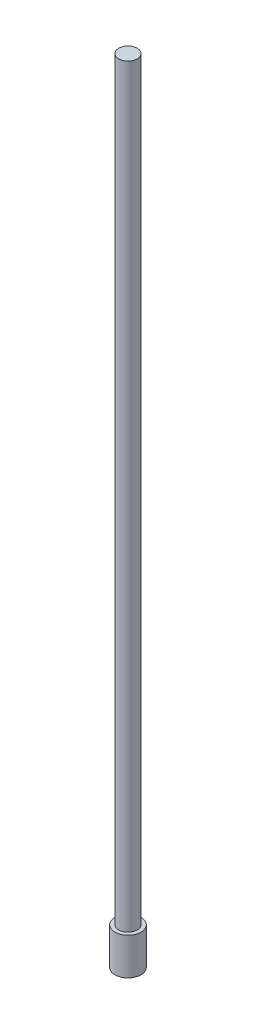
ISO-10303-21;
HEADER;
FILE_DESCRIPTION(('STEP AP214'),'2;1');
FILE_NAME('part.step','',(''),(''),'','','');
FILE_SCHEMA(('AUTOMOTIVE_DESIGN { 1 0 10303 214 1 1 1 1 }'));
ENDSEC;
DATA;
#1=APPLICATION_CONTEXT('core data for automotive mechanical design processes');
#2=APPLICATION_PROTOCOL_DEFINITION('international standard','automotive_design',2000,#1);
#3=PRODUCT_CONTEXT('',#1,'mechanical');
#4=PRODUCT('Part','Part','',(#3));
#5=PRODUCT_RELATED_PRODUCT_CATEGORY('part','',(#4));
#6=PRODUCT_DEFINITION_FORMATION('','',#4);
#7=PRODUCT_DEFINITION_CONTEXT('part definition',#1,'design');
#8=PRODUCT_DEFINITION('design','',#6,#7);
#9=PRODUCT_DEFINITION_SHAPE('','',#8);
#10=(LENGTH_UNIT() NAMED_UNIT(*) SI_UNIT(.MILLI.,.METRE.));
#11=(NAMED_UNIT(*) PLANE_ANGLE_UNIT() SI_UNIT($,.RADIAN.));
#12=(NAMED_UNIT(*) SI_UNIT($,.STERADIAN.) SOLID_ANGLE_UNIT());
#13=UNCERTAINTY_MEASURE_WITH_UNIT(LENGTH_MEASURE(1.E-05),#10,'distance_accuracy_value','');
#14=(GEOMETRIC_REPRESENTATION_CONTEXT(3) GLOBAL_UNCERTAINTY_ASSIGNED_CONTEXT((#13)) GLOBAL_UNIT_ASSIGNED_CONTEXT((#10,
#11,#12)) REPRESENTATION_CONTEXT('',''));
#15=CARTESIAN_POINT('',(0.,0.,0.));
#16=DIRECTION('',(0.,0.,1.));
#17=DIRECTION('',(1.,0.,0.));
#18=AXIS2_PLACEMENT_3D('',#15,#16,#17);
#19=CARTESIAN_POINT('',(0.,10.,0.));
#20=DIRECTION('',(0.,-1.,0.));
#21=DIRECTION('',(0.,0.,-1.));
#22=AXIS2_PLACEMENT_3D('',#19,#20,#21);
#23=CYLINDRICAL_SURFACE('',#22,2.5);
#24=CARTESIAN_POINT('',(0.,0.,0.));
#25=DIRECTION('',(0.,1.,0.));
#26=DIRECTION('',(0.,0.,1.));
#27=AXIS2_PLACEMENT_3D('',#24,#25,#26);
#28=CIRCLE('',#27,2.5);
#29=CARTESIAN_POINT('',(0.,0.,2.5));
#30=VERTEX_POINT('',#29);
#31=EDGE_CURVE('E56',#30,#30,#28,.T.);
#32=ORIENTED_EDGE('',*,*,#31,.F.);
#33=EDGE_LOOP('',(#32));
#34=FACE_BOUND('',#33,.T.);
#35=CARTESIAN_POINT('',(0.,6.25,0.));
#36=DIRECTION('',(0.,1.,0.));
#37=DIRECTION('',(0.,0.,1.));
#38=AXIS2_PLACEMENT_3D('',#35,#36,#37);
#39=CIRCLE('',#38,2.5);
#40=CARTESIAN_POINT('',(0.,6.25,2.5));
#41=VERTEX_POINT('',#40);
#42=EDGE_CURVE('E60',#41,#41,#39,.T.);
#43=ORIENTED_EDGE('',*,*,#42,.T.);
#44=EDGE_LOOP('',(#43));
#45=FACE_BOUND('',#44,.T.);
#46=ADVANCED_FACE('F41',(#34,#45),#23,.F.);
#47=CARTESIAN_POINT('',(0.,10.,0.));
#48=DIRECTION('',(0.,1.,0.));
#49=DIRECTION('',(0.,0.,1.));
#50=AXIS2_PLACEMENT_3D('',#47,#48,#49);
#51=PLANE('',#50);
#52=CARTESIAN_POINT('',(0.,10.,0.));
#53=DIRECTION('',(0.,1.,0.));
#54=DIRECTION('',(0.,0.,1.));
#55=AXIS2_PLACEMENT_3D('',#52,#53,#54);
#56=CIRCLE('',#55,3.5);
#57=CARTESIAN_POINT('',(0.,10.,3.5));
#58=VERTEX_POINT('',#57);
#59=EDGE_CURVE('E10',#58,#58,#56,.T.);
#60=ORIENTED_EDGE('',*,*,#59,.T.);
#61=EDGE_LOOP('',(#60));
#62=FACE_BOUND('',#61,.T.);
#63=CARTESIAN_POINT('',(0.,10.,0.));
#64=DIRECTION('',(0.,1.,0.));
#65=DIRECTION('',(0.,0.,1.));
#66=AXIS2_PLACEMENT_3D('',#63,#64,#65);
#67=CIRCLE('',#66,2.5);
#68=CARTESIAN_POINT('',(0.,10.,2.5));
#69=VERTEX_POINT('',#68);
#70=EDGE_CURVE('E54',#69,#69,#67,.T.);
#71=ORIENTED_EDGE('',*,*,#70,.F.);
#72=EDGE_LOOP('',(#71));
#73=FACE_BOUND('',#72,.T.);
#74=ADVANCED_FACE('F88',(#62,#73),#51,.T.);
#75=CARTESIAN_POINT('',(0.,0.,0.));
#76=DIRECTION('',(0.,1.,0.));
#77=DIRECTION('',(0.,0.,1.));
#78=AXIS2_PLACEMENT_3D('',#75,#76,#77);
#79=PLANE('',#78);
#80=CARTESIAN_POINT('',(0.,0.,0.));
#81=DIRECTION('',(0.,1.,0.));
#82=DIRECTION('',(0.,0.,1.));
#83=AXIS2_PLACEMENT_3D('',#80,#81,#82);
#84=CIRCLE('',#83,3.5);
#85=CARTESIAN_POINT('',(0.,0.,3.5));
#86=VERTEX_POINT('',#85);
#87=EDGE_CURVE('E45',#86,#86,#84,.T.);
#88=ORIENTED_EDGE('',*,*,#87,.F.);
#89=EDGE_LOOP('',(#88));
#90=FACE_BOUND('',#89,.T.);
#91=ORIENTED_EDGE('',*,*,#31,.T.);
#92=EDGE_LOOP('',(#91));
#93=FACE_BOUND('',#92,.T.);
#94=ADVANCED_FACE('F93',(#90,#93),#79,.F.);
#95=CARTESIAN_POINT('',(0.,10.,0.));
#96=DIRECTION('',(0.,-1.,0.));
#97=DIRECTION('',(0.,0.,-1.));
#98=AXIS2_PLACEMENT_3D('',#95,#96,#97);
#99=CYLINDRICAL_SURFACE('',#98,3.5);
#100=ORIENTED_EDGE('',*,*,#59,.F.);
#101=EDGE_LOOP('',(#100));
#102=FACE_BOUND('',#101,.T.);
#103=ORIENTED_EDGE('',*,*,#87,.T.);
#104=EDGE_LOOP('',(#103));
#105=FACE_BOUND('',#104,.T.);
#106=ADVANCED_FACE('F43',(#102,#105),#99,.T.);
#107=CARTESIAN_POINT('',(0.,6.25,0.));
#108=DIRECTION('',(0.,1.,0.));
#109=DIRECTION('',(0.,0.,1.));
#110=AXIS2_PLACEMENT_3D('',#107,#108,#109);
#111=PLANE('',#110);
#112=ORIENTED_EDGE('',*,*,#42,.F.);
#113=EDGE_LOOP('',(#112));
#114=FACE_BOUND('',#113,.T.);
#115=ADVANCED_FACE('F76',(#114),#111,.F.);
#116=CARTESIAN_POINT('',(0.,13.75,0.));
#117=DIRECTION('',(0.,-1.,0.));
#118=DIRECTION('',(0.,0.,-1.));
#119=AXIS2_PLACEMENT_3D('',#116,#117,#118);
#120=CYLINDRICAL_SURFACE('',#119,2.5);
#121=ORIENTED_EDGE('',*,*,#70,.T.);
#122=EDGE_LOOP('',(#121));
#123=FACE_BOUND('',#122,.T.);
#124=CARTESIAN_POINT('',(0.,213.75,0.));
#125=DIRECTION('',(0.,1.,0.));
#126=DIRECTION('',(0.,0.,1.));
#127=AXIS2_PLACEMENT_3D('',#124,#125,#126);
#128=CIRCLE('',#127,2.5);
#129=CARTESIAN_POINT('',(0.,213.75,2.5));
#130=VERTEX_POINT('',#129);
#131=EDGE_CURVE('E67',#130,#130,#128,.T.);
#132=ORIENTED_EDGE('',*,*,#131,.F.);
#133=EDGE_LOOP('',(#132));
#134=FACE_BOUND('',#133,.T.);
#135=ADVANCED_FACE('F74',(#123,#134),#120,.T.);
#136=CARTESIAN_POINT('',(0.,213.75,0.));
#137=DIRECTION('',(0.,1.,0.));
#138=DIRECTION('',(0.,0.,1.));
#139=AXIS2_PLACEMENT_3D('',#136,#137,#138);
#140=PLANE('',#139);
#141=ORIENTED_EDGE('',*,*,#131,.T.);
#142=EDGE_LOOP('',(#141));
#143=FACE_BOUND('',#142,.T.);
#144=ADVANCED_FACE('F72',(#143),#140,.T.);
#145=CLOSED_SHELL('',(#46,#74,#94,#106,#115,#135,#144));
#146=MANIFOLD_SOLID_BREP('B2',#145);
#147=ADVANCED_BREP_SHAPE_REPRESENTATION('',(#18,#146),#14);
#148=SHAPE_DEFINITION_REPRESENTATION(#9,#147);
ENDSEC;
END-ISO-10303-21;
